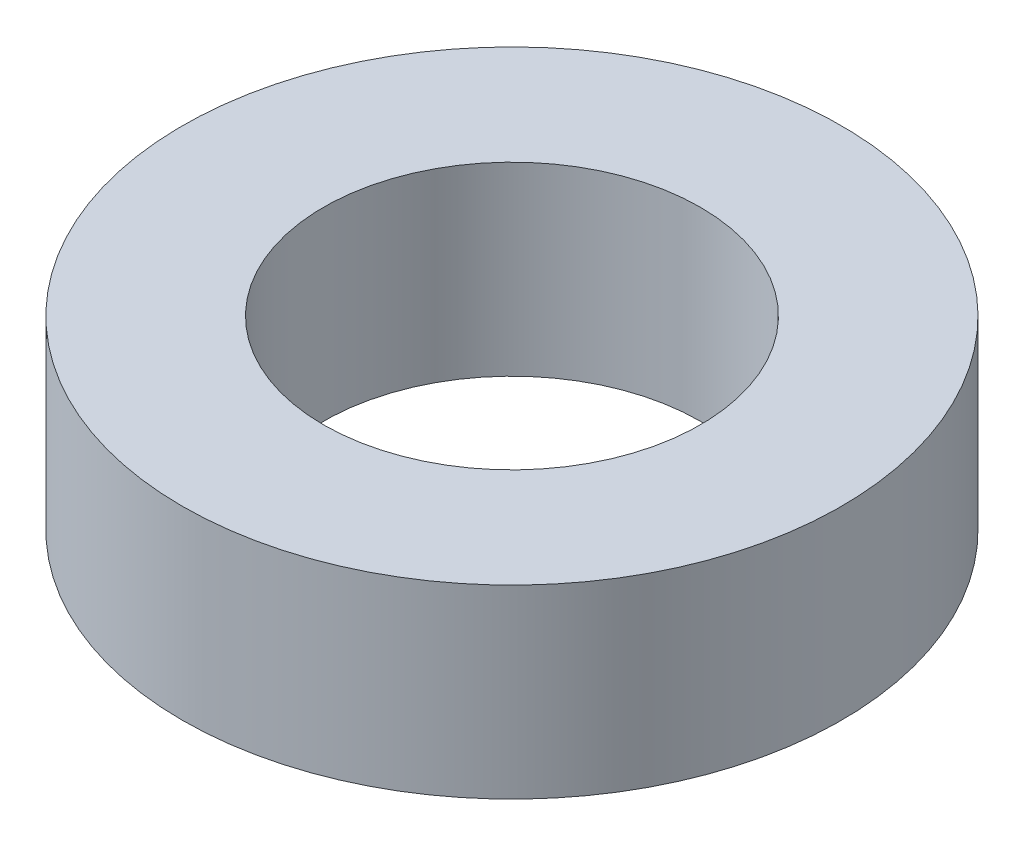
ISO-10303-21;
HEADER;
FILE_DESCRIPTION(('STEP AP214'),'2;1');
FILE_NAME('part.step','',(''),(''),'','','');
FILE_SCHEMA(('AUTOMOTIVE_DESIGN { 1 0 10303 214 1 1 1 1 }'));
ENDSEC;
DATA;
#1=APPLICATION_CONTEXT('core data for automotive mechanical design processes');
#2=APPLICATION_PROTOCOL_DEFINITION('international standard','automotive_design',2000,#1);
#3=PRODUCT_CONTEXT('',#1,'mechanical');
#4=PRODUCT('Part','Part','',(#3));
#5=PRODUCT_RELATED_PRODUCT_CATEGORY('part','',(#4));
#6=PRODUCT_DEFINITION_FORMATION('','',#4);
#7=PRODUCT_DEFINITION_CONTEXT('part definition',#1,'design');
#8=PRODUCT_DEFINITION('design','',#6,#7);
#9=PRODUCT_DEFINITION_SHAPE('','',#8);
#10=(LENGTH_UNIT() NAMED_UNIT(*) SI_UNIT(.MILLI.,.METRE.));
#11=(NAMED_UNIT(*) PLANE_ANGLE_UNIT() SI_UNIT($,.RADIAN.));
#12=(NAMED_UNIT(*) SI_UNIT($,.STERADIAN.) SOLID_ANGLE_UNIT());
#13=UNCERTAINTY_MEASURE_WITH_UNIT(LENGTH_MEASURE(1.E-05),#10,'distance_accuracy_value','');
#14=(GEOMETRIC_REPRESENTATION_CONTEXT(3) GLOBAL_UNCERTAINTY_ASSIGNED_CONTEXT((#13)) GLOBAL_UNIT_ASSIGNED_CONTEXT((#10,
#11,#12)) REPRESENTATION_CONTEXT('',''));
#15=CARTESIAN_POINT('',(0.,0.,0.));
#16=DIRECTION('',(0.,0.,1.));
#17=DIRECTION('',(1.,0.,0.));
#18=AXIS2_PLACEMENT_3D('',#15,#16,#17);
#19=CARTESIAN_POINT('',(0.,3.,0.));
#20=DIRECTION('',(0.,1.,0.));
#21=DIRECTION('',(0.,0.,1.));
#22=AXIS2_PLACEMENT_3D('',#19,#20,#21);
#23=PLANE('',#22);
#24=CARTESIAN_POINT('',(0.,3.,0.));
#25=DIRECTION('',(0.,1.,0.));
#26=DIRECTION('',(0.,0.,1.));
#27=AXIS2_PLACEMENT_3D('',#24,#25,#26);
#28=CIRCLE('',#27,5.334);
#29=CARTESIAN_POINT('',(0.,3.,5.334));
#30=VERTEX_POINT('',#29);
#31=EDGE_CURVE('E10',#30,#30,#28,.T.);
#32=ORIENTED_EDGE('',*,*,#31,.T.);
#33=EDGE_LOOP('',(#32));
#34=FACE_BOUND('',#33,.T.);
#35=CARTESIAN_POINT('',(0.,3.,0.));
#36=DIRECTION('',(0.,1.,0.));
#37=DIRECTION('',(0.,0.,1.));
#38=AXIS2_PLACEMENT_3D('',#35,#36,#37);
#39=CIRCLE('',#38,3.05);
#40=CARTESIAN_POINT('',(0.,3.,3.05));
#41=VERTEX_POINT('',#40);
#42=EDGE_CURVE('E41',#41,#41,#39,.T.);
#43=ORIENTED_EDGE('',*,*,#42,.F.);
#44=EDGE_LOOP('',(#43));
#45=FACE_BOUND('',#44,.T.);
#46=ADVANCED_FACE('F30',(#34,#45),#23,.T.);
#47=CARTESIAN_POINT('',(0.,0.,0.));
#48=DIRECTION('',(0.,1.,0.));
#49=DIRECTION('',(0.,0.,1.));
#50=AXIS2_PLACEMENT_3D('',#47,#48,#49);
#51=PLANE('',#50);
#52=CARTESIAN_POINT('',(0.,0.,0.));
#53=DIRECTION('',(0.,1.,0.));
#54=DIRECTION('',(0.,0.,1.));
#55=AXIS2_PLACEMENT_3D('',#52,#53,#54);
#56=CIRCLE('',#55,5.334);
#57=CARTESIAN_POINT('',(0.,0.,5.334));
#58=VERTEX_POINT('',#57);
#59=EDGE_CURVE('E34',#58,#58,#56,.T.);
#60=ORIENTED_EDGE('',*,*,#59,.F.);
#61=EDGE_LOOP('',(#60));
#62=FACE_BOUND('',#61,.T.);
#63=CARTESIAN_POINT('',(0.,0.,0.));
#64=DIRECTION('',(0.,1.,0.));
#65=DIRECTION('',(0.,0.,1.));
#66=AXIS2_PLACEMENT_3D('',#63,#64,#65);
#67=CIRCLE('',#66,3.05);
#68=CARTESIAN_POINT('',(0.,0.,3.05));
#69=VERTEX_POINT('',#68);
#70=EDGE_CURVE('E43',#69,#69,#67,.T.);
#71=ORIENTED_EDGE('',*,*,#70,.T.);
#72=EDGE_LOOP('',(#71));
#73=FACE_BOUND('',#72,.T.);
#74=ADVANCED_FACE('F53',(#62,#73),#51,.F.);
#75=CARTESIAN_POINT('',(0.,3.,0.));
#76=DIRECTION('',(0.,-1.,0.));
#77=DIRECTION('',(0.,0.,-1.));
#78=AXIS2_PLACEMENT_3D('',#75,#76,#77);
#79=CYLINDRICAL_SURFACE('',#78,5.334);
#80=ORIENTED_EDGE('',*,*,#31,.F.);
#81=EDGE_LOOP('',(#80));
#82=FACE_BOUND('',#81,.T.);
#83=ORIENTED_EDGE('',*,*,#59,.T.);
#84=EDGE_LOOP('',(#83));
#85=FACE_BOUND('',#84,.T.);
#86=ADVANCED_FACE('F32',(#82,#85),#79,.T.);
#87=CARTESIAN_POINT('',(0.,3.,0.));
#88=DIRECTION('',(0.,-1.,0.));
#89=DIRECTION('',(0.,0.,-1.));
#90=AXIS2_PLACEMENT_3D('',#87,#88,#89);
#91=CYLINDRICAL_SURFACE('',#90,3.05);
#92=ORIENTED_EDGE('',*,*,#42,.T.);
#93=EDGE_LOOP('',(#92));
#94=FACE_BOUND('',#93,.T.);
#95=ORIENTED_EDGE('',*,*,#70,.F.);
#96=EDGE_LOOP('',(#95));
#97=FACE_BOUND('',#96,.T.);
#98=ADVANCED_FACE('F49',(#94,#97),#91,.F.);
#99=CLOSED_SHELL('',(#46,#74,#86,#98));
#100=MANIFOLD_SOLID_BREP('B2',#99);
#101=ADVANCED_BREP_SHAPE_REPRESENTATION('',(#18,#100),#14);
#102=SHAPE_DEFINITION_REPRESENTATION(#9,#101);
ENDSEC;
END-ISO-10303-21;
